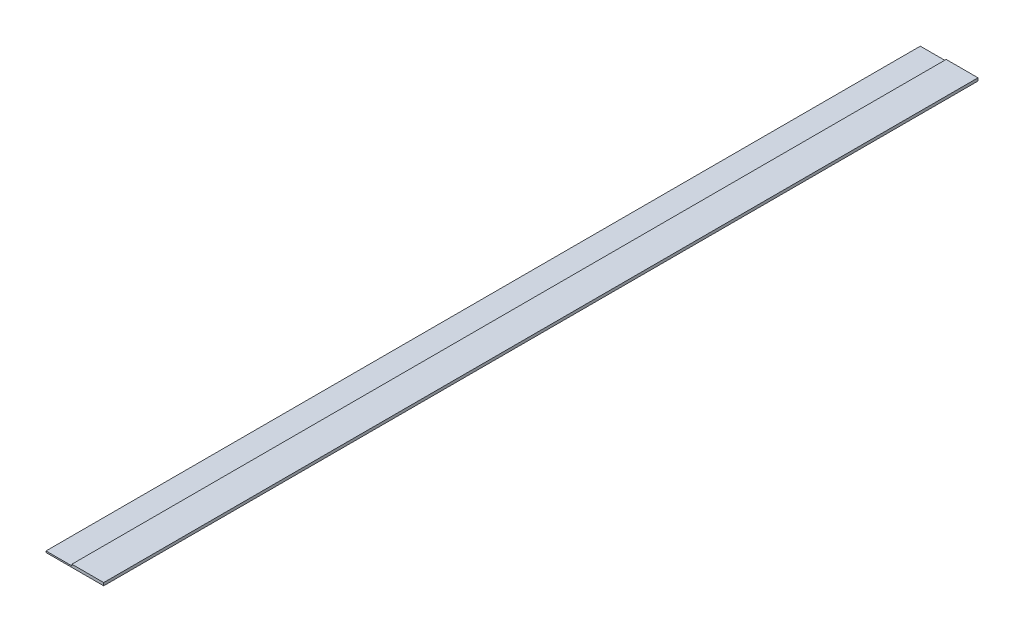
ISO-10303-21;
HEADER;
FILE_DESCRIPTION(('STEP AP214'),'2;1');
FILE_NAME('part.step','',(''),(''),'','','');
FILE_SCHEMA(('AUTOMOTIVE_DESIGN { 1 0 10303 214 1 1 1 1 }'));
ENDSEC;
DATA;
#1=APPLICATION_CONTEXT('core data for automotive mechanical design processes');
#2=APPLICATION_PROTOCOL_DEFINITION('international standard','automotive_design',2000,#1);
#3=PRODUCT_CONTEXT('',#1,'mechanical');
#4=PRODUCT('Part','Part','',(#3));
#5=PRODUCT_RELATED_PRODUCT_CATEGORY('part','',(#4));
#6=PRODUCT_DEFINITION_FORMATION('','',#4);
#7=PRODUCT_DEFINITION_CONTEXT('part definition',#1,'design');
#8=PRODUCT_DEFINITION('design','',#6,#7);
#9=PRODUCT_DEFINITION_SHAPE('','',#8);
#10=(LENGTH_UNIT() NAMED_UNIT(*) SI_UNIT(.MILLI.,.METRE.));
#11=(NAMED_UNIT(*) PLANE_ANGLE_UNIT() SI_UNIT($,.RADIAN.));
#12=(NAMED_UNIT(*) SI_UNIT($,.STERADIAN.) SOLID_ANGLE_UNIT());
#13=UNCERTAINTY_MEASURE_WITH_UNIT(LENGTH_MEASURE(1.E-05),#10,'distance_accuracy_value','');
#14=(GEOMETRIC_REPRESENTATION_CONTEXT(3) GLOBAL_UNCERTAINTY_ASSIGNED_CONTEXT((#13)) GLOBAL_UNIT_ASSIGNED_CONTEXT((#10,
#11,#12)) REPRESENTATION_CONTEXT('',''));
#15=CARTESIAN_POINT('',(0.,0.,0.));
#16=DIRECTION('',(0.,0.,1.));
#17=DIRECTION('',(1.,0.,0.));
#18=AXIS2_PLACEMENT_3D('',#15,#16,#17);
#19=CARTESIAN_POINT('',(0.,1998.07798035041,313.322376374686));
#20=DIRECTION('',(0.,1.,0.));
#21=DIRECTION('',(0.,0.,1.));
#22=AXIS2_PLACEMENT_3D('',#19,#20,#21);
#23=PLANE('',#22);
#24=DIRECTION('',(0.,0.,1.));
#25=VECTOR('',#24,1.);
#26=CARTESIAN_POINT('',(1023.17751278409,1998.07798035041,313.322376374686));
#27=LINE('',#26,#25);
#28=CARTESIAN_POINT('',(1023.17751278409,1998.07798035041,4416.30417720337));
#29=VERTEX_POINT('',#28);
#30=CARTESIAN_POINT('',(1023.17751278409,1998.07798035041,4721.10417720337));
#31=VERTEX_POINT('',#30);
#32=EDGE_CURVE('E166',#29,#31,#27,.T.);
#33=ORIENTED_EDGE('',*,*,#32,.F.);
#34=DIRECTION('',(1.,0.,0.));
#35=VECTOR('',#34,1.);
#36=CARTESIAN_POINT('',(0.,1998.07798035041,4416.30417720337));
#37=LINE('',#36,#35);
#38=CARTESIAN_POINT('',(718.377512784092,1998.07798035041,4416.30417720337));
#39=VERTEX_POINT('',#38);
#40=EDGE_CURVE('E156',#39,#29,#37,.T.);
#41=ORIENTED_EDGE('',*,*,#40,.F.);
#42=DIRECTION('',(0.,0.,-1.));
#43=VECTOR('',#42,1.);
#44=CARTESIAN_POINT('',(718.377512784092,1998.07798035041,313.322376374686));
#45=LINE('',#44,#43);
#46=CARTESIAN_POINT('',(718.377512784092,1998.07798035041,4721.10417720337));
#47=VERTEX_POINT('',#46);
#48=EDGE_CURVE('E160',#47,#39,#45,.T.);
#49=ORIENTED_EDGE('',*,*,#48,.F.);
#50=DIRECTION('',(-1.,0.,0.));
#51=VECTOR('',#50,1.);
#52=CARTESIAN_POINT('',(0.,1998.07798035041,4721.10417720337));
#53=LINE('',#52,#51);
#54=EDGE_CURVE('E163',#31,#47,#53,.T.);
#55=ORIENTED_EDGE('',*,*,#54,.F.);
#56=EDGE_LOOP('',(#33,#41,#49,#55));
#57=FACE_BOUND('',#56,.T.);
#58=DIRECTION('',(-1.,0.,0.));
#59=VECTOR('',#58,1.);
#60=CARTESIAN_POINT('',(0.,1998.07798035041,657.904177203367));
#61=LINE('',#60,#59);
#62=CARTESIAN_POINT('',(1042.85832579249,1998.07798035041,657.904177203367));
#63=VERTEX_POINT('',#62);
#64=CARTESIAN_POINT('',(698.696699775697,1998.07798035041,657.904177203367));
#65=VERTEX_POINT('',#64);
#66=EDGE_CURVE('E109',#63,#65,#61,.T.);
#67=ORIENTED_EDGE('',*,*,#66,.F.);
#68=DIRECTION('',(0.,0.,1.));
#69=VECTOR('',#68,1.);
#70=CARTESIAN_POINT('',(1042.85832579249,1998.07798035041,313.322376374686));
#71=LINE('',#70,#69);
#72=CARTESIAN_POINT('',(1042.85832579249,1998.07798035041,5872.30417720337));
#73=VERTEX_POINT('',#72);
#74=EDGE_CURVE('E128',#63,#73,#71,.T.);
#75=ORIENTED_EDGE('',*,*,#74,.T.);
#76=DIRECTION('',(-1.,0.,0.));
#77=VECTOR('',#76,1.);
#78=CARTESIAN_POINT('',(0.,1998.07798035041,5872.30417720337));
#79=LINE('',#78,#77);
#80=CARTESIAN_POINT('',(698.696699775697,1998.07798035041,5872.30417720337));
#81=VERTEX_POINT('',#80);
#82=EDGE_CURVE('E124',#73,#81,#79,.T.);
#83=ORIENTED_EDGE('',*,*,#82,.T.);
#84=DIRECTION('',(0.,0.,1.));
#85=VECTOR('',#84,1.);
#86=CARTESIAN_POINT('',(698.696699775697,1998.07798035041,313.322376374686));
#87=LINE('',#86,#85);
#88=EDGE_CURVE('E121',#65,#81,#87,.T.);
#89=ORIENTED_EDGE('',*,*,#88,.F.);
#90=EDGE_LOOP('',(#67,#75,#83,#89));
#91=FACE_BOUND('',#90,.T.);
#92=DIRECTION('',(0.,0.,1.));
#93=VECTOR('',#92,1.);
#94=CARTESIAN_POINT('',(1023.17751278409,1998.07798035041,313.322376374686));
#95=LINE('',#94,#93);
#96=CARTESIAN_POINT('',(1023.17751278409,1998.07798035041,1809.10417720337));
#97=VERTEX_POINT('',#96);
#98=CARTESIAN_POINT('',(1023.17751278409,1998.07798035041,2113.90417720337));
#99=VERTEX_POINT('',#98);
#100=EDGE_CURVE('E11',#97,#99,#95,.T.);
#101=ORIENTED_EDGE('',*,*,#100,.F.);
#102=DIRECTION('',(1.,0.,0.));
#103=VECTOR('',#102,1.);
#104=CARTESIAN_POINT('',(0.,1998.07798035041,1809.10417720337));
#105=LINE('',#104,#103);
#106=CARTESIAN_POINT('',(718.377512784093,1998.07798035041,1809.10417720337));
#107=VERTEX_POINT('',#106);
#108=EDGE_CURVE('E169',#107,#97,#105,.T.);
#109=ORIENTED_EDGE('',*,*,#108,.F.);
#110=DIRECTION('',(0.,0.,-1.));
#111=VECTOR('',#110,1.);
#112=CARTESIAN_POINT('',(718.377512784093,1998.07798035041,313.322376374686));
#113=LINE('',#112,#111);
#114=CARTESIAN_POINT('',(718.377512784093,1998.07798035041,2113.90417720337));
#115=VERTEX_POINT('',#114);
#116=EDGE_CURVE('E172',#115,#107,#113,.T.);
#117=ORIENTED_EDGE('',*,*,#116,.F.);
#118=DIRECTION('',(-1.,0.,0.));
#119=VECTOR('',#118,1.);
#120=CARTESIAN_POINT('',(0.,1998.07798035041,2113.90417720337));
#121=LINE('',#120,#119);
#122=EDGE_CURVE('E46',#99,#115,#121,.T.);
#123=ORIENTED_EDGE('',*,*,#122,.F.);
#124=EDGE_LOOP('',(#101,#109,#117,#123));
#125=FACE_BOUND('',#124,.T.);
#126=ADVANCED_FACE('F37',(#57,#91,#125),#23,.F.);
#127=ORIENTED_EDGE('',*,*,#108,.T.);
#128=ORIENTED_EDGE('',*,*,#100,.T.);
#129=ORIENTED_EDGE('',*,*,#122,.T.);
#130=ORIENTED_EDGE('',*,*,#116,.T.);
#131=EDGE_LOOP('',(#127,#128,#129,#130));
#132=FACE_BOUND('',#131,.T.);
#133=ADVANCED_FACE('F192',(#132),#23,.F.);
#134=CARTESIAN_POINT('',(698.696699775697,2168.44581294071,657.904177203367));
#135=DIRECTION('',(0.,0.,-1.));
#136=DIRECTION('',(-1.,0.,0.));
#137=AXIS2_PLACEMENT_3D('',#134,#135,#136);
#138=PLANE('',#137);
#139=DIRECTION('',(0.,-1.,0.));
#140=VECTOR('',#139,1.);
#141=CARTESIAN_POINT('',(698.696699775697,0.,657.904177203367));
#142=LINE('',#141,#140);
#143=CARTESIAN_POINT('',(698.696699775697,2006.39357240775,657.904177203367));
#144=VERTEX_POINT('',#143);
#145=EDGE_CURVE('E112',#144,#65,#142,.T.);
#146=ORIENTED_EDGE('',*,*,#145,.F.);
#147=DIRECTION('',(1.,0.,0.));
#148=VECTOR('',#147,1.);
#149=CARTESIAN_POINT('',(-7.21205559905655E-13,2006.39357240775,657.904177203367));
#150=LINE('',#149,#148);
#151=CARTESIAN_POINT('',(853.128699775697,2006.39357240775,657.904177203367));
#152=VERTEX_POINT('',#151);
#153=EDGE_CURVE('E138',#144,#152,#150,.T.);
#154=ORIENTED_EDGE('',*,*,#153,.T.);
#155=DIRECTION('',(0.,1.,0.));
#156=VECTOR('',#155,1.);
#157=CARTESIAN_POINT('',(853.128699775697,0.,657.904177203367));
#158=LINE('',#157,#156);
#159=CARTESIAN_POINT('',(853.128699775697,2015.08952466052,657.904177203367));
#160=VERTEX_POINT('',#159);
#161=EDGE_CURVE('E140',#152,#160,#158,.T.);
#162=ORIENTED_EDGE('',*,*,#161,.T.);
#163=DIRECTION('',(1.,0.,0.));
#164=VECTOR('',#163,1.);
#165=CARTESIAN_POINT('',(-3.90499187840092E-11,2015.0895246605,657.904177203367));
#166=LINE('',#165,#164);
#167=CARTESIAN_POINT('',(1042.85832579249,2015.08952466056,657.904177203367));
#168=VERTEX_POINT('',#167);
#169=EDGE_CURVE('E142',#160,#168,#166,.T.);
#170=ORIENTED_EDGE('',*,*,#169,.T.);
#171=DIRECTION('',(0.,-1.,0.));
#172=VECTOR('',#171,1.);
#173=CARTESIAN_POINT('',(1042.85832579249,0.,657.904177203367));
#174=LINE('',#173,#172);
#175=EDGE_CURVE('E115',#168,#63,#174,.T.);
#176=ORIENTED_EDGE('',*,*,#175,.T.);
#177=ORIENTED_EDGE('',*,*,#66,.T.);
#178=EDGE_LOOP('',(#146,#154,#162,#170,#176,#177));
#179=FACE_BOUND('',#178,.T.);
#180=ADVANCED_FACE('F39',(#179),#138,.T.);
#181=CARTESIAN_POINT('',(0.,0.,5872.30417720337));
#182=DIRECTION('',(0.,0.,1.));
#183=DIRECTION('',(1.,0.,0.));
#184=AXIS2_PLACEMENT_3D('',#181,#182,#183);
#185=PLANE('',#184);
#186=DIRECTION('',(1.,0.,0.));
#187=VECTOR('',#186,1.);
#188=CARTESIAN_POINT('',(-7.21205559905655E-13,2006.39357240775,5872.30417720337));
#189=LINE('',#188,#187);
#190=CARTESIAN_POINT('',(698.696699775697,2006.39357240775,5872.30417720337));
#191=VERTEX_POINT('',#190);
#192=CARTESIAN_POINT('',(853.128699775697,2006.39357240775,5872.30417720337));
#193=VERTEX_POINT('',#192);
#194=EDGE_CURVE('E137',#191,#193,#189,.T.);
#195=ORIENTED_EDGE('',*,*,#194,.F.);
#196=DIRECTION('',(0.,-1.,0.));
#197=VECTOR('',#196,1.);
#198=CARTESIAN_POINT('',(698.696699775697,0.,5872.30417720337));
#199=LINE('',#198,#197);
#200=EDGE_CURVE('E118',#191,#81,#199,.T.);
#201=ORIENTED_EDGE('',*,*,#200,.T.);
#202=ORIENTED_EDGE('',*,*,#82,.F.);
#203=DIRECTION('',(0.,-1.,0.));
#204=VECTOR('',#203,1.);
#205=CARTESIAN_POINT('',(1042.85832579249,0.,5872.30417720337));
#206=LINE('',#205,#204);
#207=CARTESIAN_POINT('',(1042.85832579249,2015.08952466056,5872.30417720337));
#208=VERTEX_POINT('',#207);
#209=EDGE_CURVE('E151',#208,#73,#206,.T.);
#210=ORIENTED_EDGE('',*,*,#209,.F.);
#211=DIRECTION('',(1.,0.,0.));
#212=VECTOR('',#211,1.);
#213=CARTESIAN_POINT('',(-3.90499187840092E-11,2015.0895246605,5872.30417720337));
#214=LINE('',#213,#212);
#215=CARTESIAN_POINT('',(853.128699775697,2015.08952466052,5872.30417720337));
#216=VERTEX_POINT('',#215);
#217=EDGE_CURVE('E148',#216,#208,#214,.T.);
#218=ORIENTED_EDGE('',*,*,#217,.F.);
#219=DIRECTION('',(0.,1.,0.));
#220=VECTOR('',#219,1.);
#221=CARTESIAN_POINT('',(853.128699775697,0.,5872.30417720337));
#222=LINE('',#221,#220);
#223=EDGE_CURVE('E147',#193,#216,#222,.T.);
#224=ORIENTED_EDGE('',*,*,#223,.F.);
#225=EDGE_LOOP('',(#195,#201,#202,#210,#218,#224));
#226=FACE_BOUND('',#225,.T.);
#227=ADVANCED_FACE('F211',(#226),#185,.T.);
#228=CARTESIAN_POINT('',(698.696699775697,0.,313.322376374686));
#229=DIRECTION('',(-1.,0.,0.));
#230=DIRECTION('',(0.,0.,1.));
#231=AXIS2_PLACEMENT_3D('',#228,#229,#230);
#232=PLANE('',#231);
#233=DIRECTION('',(0.,0.,1.));
#234=VECTOR('',#233,1.);
#235=CARTESIAN_POINT('',(698.696699775697,2006.39357240775,313.322376374686));
#236=LINE('',#235,#234);
#237=EDGE_CURVE('E132',#144,#191,#236,.T.);
#238=ORIENTED_EDGE('',*,*,#237,.F.);
#239=ORIENTED_EDGE('',*,*,#145,.T.);
#240=ORIENTED_EDGE('',*,*,#88,.T.);
#241=ORIENTED_EDGE('',*,*,#200,.F.);
#242=EDGE_LOOP('',(#238,#239,#240,#241));
#243=FACE_BOUND('',#242,.T.);
#244=ADVANCED_FACE('F131',(#243),#232,.T.);
#245=ORIENTED_EDGE('',*,*,#40,.T.);
#246=ORIENTED_EDGE('',*,*,#32,.T.);
#247=ORIENTED_EDGE('',*,*,#54,.T.);
#248=ORIENTED_EDGE('',*,*,#48,.T.);
#249=EDGE_LOOP('',(#245,#246,#247,#248));
#250=FACE_BOUND('',#249,.T.);
#251=ADVANCED_FACE('F196',(#250),#23,.F.);
#252=CARTESIAN_POINT('',(1042.85832579249,0.,313.322376374686));
#253=DIRECTION('',(-1.,0.,0.));
#254=DIRECTION('',(0.,0.,1.));
#255=AXIS2_PLACEMENT_3D('',#252,#253,#254);
#256=PLANE('',#255);
#257=ORIENTED_EDGE('',*,*,#175,.F.);
#258=DIRECTION('',(0.,0.,1.));
#259=VECTOR('',#258,1.);
#260=CARTESIAN_POINT('',(1042.85832579249,2015.08952466056,313.322376374686));
#261=LINE('',#260,#259);
#262=EDGE_CURVE('E152',#168,#208,#261,.T.);
#263=ORIENTED_EDGE('',*,*,#262,.T.);
#264=ORIENTED_EDGE('',*,*,#209,.T.);
#265=ORIENTED_EDGE('',*,*,#74,.F.);
#266=EDGE_LOOP('',(#257,#263,#264,#265));
#267=FACE_BOUND('',#266,.T.);
#268=ADVANCED_FACE('F203',(#267),#256,.F.);
#269=CARTESIAN_POINT('',(-3.90499187840092E-11,2015.0895246605,313.322376374686));
#270=DIRECTION('',(0.,-1.,0.));
#271=DIRECTION('',(1.,0.,0.));
#272=AXIS2_PLACEMENT_3D('',#269,#270,#271);
#273=PLANE('',#272);
#274=ORIENTED_EDGE('',*,*,#169,.F.);
#275=DIRECTION('',(0.,0.,1.));
#276=VECTOR('',#275,1.);
#277=CARTESIAN_POINT('',(853.128699775697,2015.08952466052,313.322376374686));
#278=LINE('',#277,#276);
#279=EDGE_CURVE('E149',#160,#216,#278,.T.);
#280=ORIENTED_EDGE('',*,*,#279,.T.);
#281=ORIENTED_EDGE('',*,*,#217,.T.);
#282=ORIENTED_EDGE('',*,*,#262,.F.);
#283=EDGE_LOOP('',(#274,#280,#281,#282));
#284=FACE_BOUND('',#283,.T.);
#285=ADVANCED_FACE('F208',(#284),#273,.F.);
#286=CARTESIAN_POINT('',(853.128699775697,0.,313.322376374686));
#287=DIRECTION('',(1.,0.,0.));
#288=DIRECTION('',(0.,0.,-1.));
#289=AXIS2_PLACEMENT_3D('',#286,#287,#288);
#290=PLANE('',#289);
#291=ORIENTED_EDGE('',*,*,#161,.F.);
#292=DIRECTION('',(0.,0.,1.));
#293=VECTOR('',#292,1.);
#294=CARTESIAN_POINT('',(853.128699775697,2006.39357240775,313.322376374686));
#295=LINE('',#294,#293);
#296=EDGE_CURVE('E145',#152,#193,#295,.T.);
#297=ORIENTED_EDGE('',*,*,#296,.T.);
#298=ORIENTED_EDGE('',*,*,#223,.T.);
#299=ORIENTED_EDGE('',*,*,#279,.F.);
#300=EDGE_LOOP('',(#291,#297,#298,#299));
#301=FACE_BOUND('',#300,.T.);
#302=ADVANCED_FACE('F229',(#301),#290,.F.);
#303=CARTESIAN_POINT('',(-7.21205559905655E-13,2006.39357240775,313.322376374686));
#304=DIRECTION('',(0.,-1.,0.));
#305=DIRECTION('',(1.,0.,0.));
#306=AXIS2_PLACEMENT_3D('',#303,#304,#305);
#307=PLANE('',#306);
#308=ORIENTED_EDGE('',*,*,#153,.F.);
#309=ORIENTED_EDGE('',*,*,#237,.T.);
#310=ORIENTED_EDGE('',*,*,#194,.T.);
#311=ORIENTED_EDGE('',*,*,#296,.F.);
#312=EDGE_LOOP('',(#308,#309,#310,#311));
#313=FACE_BOUND('',#312,.T.);
#314=ADVANCED_FACE('F226',(#313),#307,.F.);
#315=CLOSED_SHELL('',(#126,#133,#180,#227,#244,#251,#268,#285,#302,#314));
#316=MANIFOLD_SOLID_BREP('B2',#315);
#317=ADVANCED_BREP_SHAPE_REPRESENTATION('',(#18,#316),#14);
#318=SHAPE_DEFINITION_REPRESENTATION(#9,#317);
ENDSEC;
END-ISO-10303-21;
